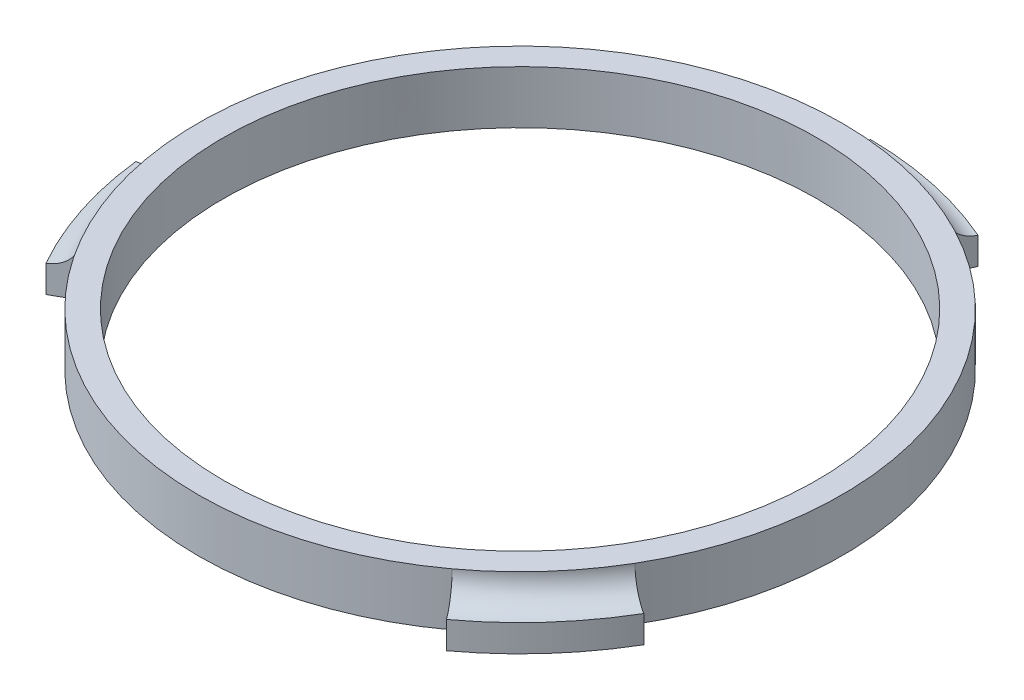
ISO-10303-21;
HEADER;
FILE_DESCRIPTION(('STEP AP214'),'2;1');
FILE_NAME('part.step','',(''),(''),'','','');
FILE_SCHEMA(('AUTOMOTIVE_DESIGN { 1 0 10303 214 1 1 1 1 }'));
ENDSEC;
DATA;
#1=APPLICATION_CONTEXT('core data for automotive mechanical design processes');
#2=APPLICATION_PROTOCOL_DEFINITION('international standard','automotive_design',2000,#1);
#3=PRODUCT_CONTEXT('',#1,'mechanical');
#4=PRODUCT('Part','Part','',(#3));
#5=PRODUCT_RELATED_PRODUCT_CATEGORY('part','',(#4));
#6=PRODUCT_DEFINITION_FORMATION('','',#4);
#7=PRODUCT_DEFINITION_CONTEXT('part definition',#1,'design');
#8=PRODUCT_DEFINITION('design','',#6,#7);
#9=PRODUCT_DEFINITION_SHAPE('','',#8);
#10=(LENGTH_UNIT() NAMED_UNIT(*) SI_UNIT(.MILLI.,.METRE.));
#11=(NAMED_UNIT(*) PLANE_ANGLE_UNIT() SI_UNIT($,.RADIAN.));
#12=(NAMED_UNIT(*) SI_UNIT($,.STERADIAN.) SOLID_ANGLE_UNIT());
#13=UNCERTAINTY_MEASURE_WITH_UNIT(LENGTH_MEASURE(1.E-05),#10,'distance_accuracy_value','');
#14=(GEOMETRIC_REPRESENTATION_CONTEXT(3) GLOBAL_UNCERTAINTY_ASSIGNED_CONTEXT((#13)) GLOBAL_UNIT_ASSIGNED_CONTEXT((#10,
#11,#12)) REPRESENTATION_CONTEXT('',''));
#15=CARTESIAN_POINT('',(0.,0.,0.));
#16=DIRECTION('',(0.,0.,1.));
#17=DIRECTION('',(1.,0.,0.));
#18=AXIS2_PLACEMENT_3D('',#15,#16,#17);
#19=CARTESIAN_POINT('',(0.,9.8,0.));
#20=DIRECTION('',(0.,-1.,0.));
#21=DIRECTION('',(0.,0.,-1.));
#22=AXIS2_PLACEMENT_3D('',#19,#20,#21);
#23=CYLINDRICAL_SURFACE('',#22,24.95);
#24=CARTESIAN_POINT('',(0.,9.8,0.));
#25=DIRECTION('',(0.,1.,0.));
#26=DIRECTION('',(0.,0.,1.));
#27=AXIS2_PLACEMENT_3D('',#24,#25,#26);
#28=CIRCLE('',#27,24.95);
#29=CARTESIAN_POINT('',(21.5229083842175,9.8,12.620099630533));
#30=VERTEX_POINT('',#29);
#31=CARTESIAN_POINT('',(9.97989349819901,9.8,-22.867099198731));
#32=VERTEX_POINT('',#31);
#33=EDGE_CURVE('E273',#30,#32,#28,.T.);
#34=ORIENTED_EDGE('',*,*,#33,.F.);
#35=DIRECTION('',(0.,1.,0.));
#36=VECTOR('',#35,1.);
#37=CARTESIAN_POINT('',(21.5229083842175,5.8,12.620099630533));
#38=LINE('',#37,#36);
#39=CARTESIAN_POINT('',(21.5229083842175,5.7,12.620099630533));
#40=VERTEX_POINT('',#39);
#41=EDGE_CURVE('E275',#40,#30,#38,.T.);
#42=ORIENTED_EDGE('',*,*,#41,.F.);
#43=CARTESIAN_POINT('',(0.,5.7,0.));
#44=DIRECTION('',(0.,-1.,0.));
#45=DIRECTION('',(0.,0.,-1.));
#46=AXIS2_PLACEMENT_3D('',#43,#44,#45);
#47=CIRCLE('',#46,24.95);
#48=CARTESIAN_POINT('',(9.97989349819902,5.7,-22.867099198731));
#49=VERTEX_POINT('',#48);
#50=EDGE_CURVE('E100',#40,#49,#47,.F.);
#51=ORIENTED_EDGE('',*,*,#50,.T.);
#52=DIRECTION('',(0.,1.,0.));
#53=VECTOR('',#52,1.);
#54=CARTESIAN_POINT('',(9.97989349819902,5.8,-22.867099198731));
#55=LINE('',#54,#53);
#56=EDGE_CURVE('E114',#49,#32,#55,.T.);
#57=ORIENTED_EDGE('',*,*,#56,.T.);
#58=EDGE_LOOP('',(#34,#42,#51,#57));
#59=FACE_BOUND('',#58,.T.);
#60=ADVANCED_FACE('F36',(#59),#23,.T.);
#61=DIRECTION('',(0.,1.,0.));
#62=VECTOR('',#61,1.);
#63=CARTESIAN_POINT('',(14.8135420678603,5.8,20.0763908958691));
#64=LINE('',#63,#62);
#65=CARTESIAN_POINT('',(14.8135420678603,5.7,20.0763908958691));
#66=VERTEX_POINT('',#65);
#67=CARTESIAN_POINT('',(14.8135420678603,9.8,20.0763908958691));
#68=VERTEX_POINT('',#67);
#69=EDGE_CURVE('E127',#66,#68,#64,.T.);
#70=ORIENTED_EDGE('',*,*,#69,.T.);
#71=CARTESIAN_POINT('',(-21.690781070441,9.8,12.3293356087908));
#72=VERTEX_POINT('',#71);
#73=EDGE_CURVE('E288',#72,#68,#28,.T.);
#74=ORIENTED_EDGE('',*,*,#73,.F.);
#75=DIRECTION('',(0.,1.,0.));
#76=VECTOR('',#75,1.);
#77=CARTESIAN_POINT('',(-21.690781070441,5.8,12.3293356087908));
#78=LINE('',#77,#76);
#79=CARTESIAN_POINT('',(-21.690781070441,5.7,12.3293356087908));
#80=VERTEX_POINT('',#79);
#81=EDGE_CURVE('E55',#80,#72,#78,.T.);
#82=ORIENTED_EDGE('',*,*,#81,.F.);
#83=CARTESIAN_POINT('',(0.,5.7,0.));
#84=DIRECTION('',(0.,-1.,0.));
#85=DIRECTION('',(0.,0.,-1.));
#86=AXIS2_PLACEMENT_3D('',#83,#84,#85);
#87=CIRCLE('',#86,24.95);
#88=EDGE_CURVE('E154',#80,#66,#87,.F.);
#89=ORIENTED_EDGE('',*,*,#88,.T.);
#90=EDGE_LOOP('',(#70,#74,#82,#89));
#91=FACE_BOUND('',#90,.T.);
#92=ADVANCED_FACE('F253',(#91),#23,.T.);
#93=CARTESIAN_POINT('',(0.,6.,0.));
#94=DIRECTION('',(0.,1.,0.));
#95=DIRECTION('',(0.,0.,1.));
#96=AXIS2_PLACEMENT_3D('',#93,#94,#95);
#97=CYLINDRICAL_SURFACE('',#96,26.95);
#98=DIRECTION('',(0.,1.,0.));
#99=VECTOR('',#98,1.);
#100=CARTESIAN_POINT('',(10.7945771498696,5.8,-24.6937158839149));
#101=LINE('',#100,#99);
#102=CARTESIAN_POINT('',(10.7945771498696,5.7,-24.6937158839149));
#103=VERTEX_POINT('',#102);
#104=CARTESIAN_POINT('',(10.7945771498696,7.8,-24.6937158839149));
#105=VERTEX_POINT('',#104);
#106=EDGE_CURVE('E112',#103,#105,#101,.T.);
#107=ORIENTED_EDGE('',*,*,#106,.F.);
#108=CARTESIAN_POINT('',(0.,5.7,0.));
#109=DIRECTION('',(0.,-1.,0.));
#110=DIRECTION('',(0.,0.,-1.));
#111=AXIS2_PLACEMENT_3D('',#108,#109,#110);
#112=CIRCLE('',#111,26.95);
#113=CARTESIAN_POINT('',(0.200013900237467,5.7,-26.949257771592));
#114=VERTEX_POINT('',#113);
#115=EDGE_CURVE('E123',#114,#103,#112,.T.);
#116=ORIENTED_EDGE('',*,*,#115,.F.);
#117=DIRECTION('',(0.,1.,0.));
#118=VECTOR('',#117,1.);
#119=CARTESIAN_POINT('',(0.200013900237467,6.,-26.949257771592));
#120=LINE('',#119,#118);
#121=CARTESIAN_POINT('',(0.200013900237467,7.8,-26.949257771592));
#122=VERTEX_POINT('',#121);
#123=EDGE_CURVE('E134',#122,#114,#120,.F.);
#124=ORIENTED_EDGE('',*,*,#123,.F.);
#125=CARTESIAN_POINT('',(0.,7.8,0.));
#126=DIRECTION('',(0.,-1.,0.));
#127=DIRECTION('',(0.,0.,-1.));
#128=AXIS2_PLACEMENT_3D('',#125,#126,#127);
#129=CIRCLE('',#128,26.95);
#130=EDGE_CURVE('E125',#122,#105,#129,.T.);
#131=ORIENTED_EDGE('',*,*,#130,.T.);
#132=EDGE_LOOP('',(#107,#116,#124,#131));
#133=FACE_BOUND('',#132,.T.);
#134=ADVANCED_FACE('F121',(#133),#97,.T.);
#135=DIRECTION('',(0.,1.,0.));
#136=VECTOR('',#135,1.);
#137=CARTESIAN_POINT('',(23.2387348932153,5.8,13.6478460045114));
#138=LINE('',#137,#136);
#139=CARTESIAN_POINT('',(23.2387348932153,5.7,13.6478460045114));
#140=VERTEX_POINT('',#139);
#141=CARTESIAN_POINT('',(23.2387348932153,7.8,13.6478460045114));
#142=VERTEX_POINT('',#141);
#143=EDGE_CURVE('E128',#140,#142,#138,.T.);
#144=ORIENTED_EDGE('',*,*,#143,.T.);
#145=CARTESIAN_POINT('',(15.9880966943707,7.8,21.6952359768557));
#146=VERTEX_POINT('',#145);
#147=EDGE_CURVE('E318',#142,#146,#129,.T.);
#148=ORIENTED_EDGE('',*,*,#147,.T.);
#149=DIRECTION('',(0.,1.,0.));
#150=VECTOR('',#149,1.);
#151=CARTESIAN_POINT('',(15.9880966943707,5.8,21.6952359768557));
#152=LINE('',#151,#150);
#153=CARTESIAN_POINT('',(15.9880966943707,5.7,21.6952359768557));
#154=VERTEX_POINT('',#153);
#155=EDGE_CURVE('E163',#154,#146,#152,.T.);
#156=ORIENTED_EDGE('',*,*,#155,.F.);
#157=CARTESIAN_POINT('',(0.,5.7,0.));
#158=DIRECTION('',(0.,-1.,0.));
#159=DIRECTION('',(0.,0.,-1.));
#160=AXIS2_PLACEMENT_3D('',#157,#158,#159);
#161=CIRCLE('',#160,26.95);
#162=EDGE_CURVE('E135',#140,#154,#161,.T.);
#163=ORIENTED_EDGE('',*,*,#162,.F.);
#164=EDGE_LOOP('',(#144,#148,#156,#163));
#165=FACE_BOUND('',#164,.T.);
#166=ADVANCED_FACE('F257',(#165),#97,.T.);
#167=DIRECTION('',(0.,1.,0.));
#168=VECTOR('',#167,1.);
#169=CARTESIAN_POINT('',(-23.4387487934526,5.8,13.3014117670805));
#170=LINE('',#169,#168);
#171=CARTESIAN_POINT('',(-23.4387487934526,5.7,13.3014117670805));
#172=VERTEX_POINT('',#171);
#173=CARTESIAN_POINT('',(-23.4387487934526,7.8,13.3014117670805));
#174=VERTEX_POINT('',#173);
#175=EDGE_CURVE('E307',#172,#174,#170,.T.);
#176=ORIENTED_EDGE('',*,*,#175,.T.);
#177=CARTESIAN_POINT('',(-26.7826738442405,7.8,2.9984799070591));
#178=VERTEX_POINT('',#177);
#179=EDGE_CURVE('E292',#174,#178,#129,.T.);
#180=ORIENTED_EDGE('',*,*,#179,.T.);
#181=DIRECTION('',(0.,1.,0.));
#182=VECTOR('',#181,1.);
#183=CARTESIAN_POINT('',(-26.7826738442405,6.,2.9984799070591));
#184=LINE('',#183,#182);
#185=CARTESIAN_POINT('',(-26.7826738442405,5.7,2.9984799070591));
#186=VERTEX_POINT('',#185);
#187=EDGE_CURVE('E137',#186,#178,#184,.T.);
#188=ORIENTED_EDGE('',*,*,#187,.F.);
#189=CARTESIAN_POINT('',(0.,5.7,0.));
#190=DIRECTION('',(0.,-1.,0.));
#191=DIRECTION('',(0.,0.,-1.));
#192=AXIS2_PLACEMENT_3D('',#189,#190,#191);
#193=CIRCLE('',#192,26.95);
#194=EDGE_CURVE('E140',#172,#186,#193,.T.);
#195=ORIENTED_EDGE('',*,*,#194,.F.);
#196=EDGE_LOOP('',(#176,#180,#188,#195));
#197=FACE_BOUND('',#196,.T.);
#198=ADVANCED_FACE('F258',(#197),#97,.T.);
#199=CARTESIAN_POINT('',(0.,5.7,0.));
#200=DIRECTION('',(0.,-1.,0.));
#201=DIRECTION('',(0.,0.,-1.));
#202=AXIS2_PLACEMENT_3D('',#199,#200,#201);
#203=PLANE('',#202);
#204=ORIENTED_EDGE('',*,*,#115,.T.);
#205=DIRECTION('',(-0.407329709642397,0.,0.913281176660639));
#206=VECTOR('',#205,1.);
#207=CARTESIAN_POINT('',(-0.182656235332074,5.7,-0.0814659419284554));
#208=LINE('',#207,#206);
#209=EDGE_CURVE('E108',#103,#49,#208,.T.);
#210=ORIENTED_EDGE('',*,*,#209,.T.);
#211=ORIENTED_EDGE('',*,*,#50,.F.);
#212=DIRECTION('',(0.857878594951562,0.,0.513852426601192));
#213=VECTOR('',#212,1.);
#214=CARTESIAN_POINT('',(0.119771478640206,5.7,-0.199958942474502));
#215=LINE('',#214,#213);
#216=EDGE_CURVE('E118',#40,#140,#215,.T.);
#217=ORIENTED_EDGE('',*,*,#216,.T.);
#218=ORIENTED_EDGE('',*,*,#162,.T.);
#219=DIRECTION('',(-0.587259844965055,0.,-0.809398464596777));
#220=VECTOR('',#219,1.);
#221=CARTESIAN_POINT('',(0.161879692919308,5.7,-0.117451968992976));
#222=LINE('',#221,#220);
#223=EDGE_CURVE('E162',#154,#66,#222,.T.);
#224=ORIENTED_EDGE('',*,*,#223,.T.);
#225=ORIENTED_EDGE('',*,*,#88,.F.);
#226=DIRECTION('',(-0.873948552708695,0.,0.486018443290353));
#227=VECTOR('',#226,1.);
#228=CARTESIAN_POINT('',(0.113283784576686,5.7,0.203704614388495));
#229=LINE('',#228,#227);
#230=EDGE_CURVE('E159',#80,#172,#229,.T.);
#231=ORIENTED_EDGE('',*,*,#230,.T.);
#232=ORIENTED_EDGE('',*,*,#194,.T.);
#233=DIRECTION('',(0.994589554607456,0.,-0.103882712063855));
#234=VECTOR('',#233,1.);
#235=CARTESIAN_POINT('',(0.0207765424127649,5.7,0.198917910921433));
#236=LINE('',#235,#234);
#237=CARTESIAN_POINT('',(-24.7934355660594,5.7,2.79070830286179));
#238=VERTEX_POINT('',#237);
#239=EDGE_CURVE('E150',#186,#238,#236,.T.);
#240=ORIENTED_EDGE('',*,*,#239,.T.);
#241=CARTESIAN_POINT('',(0.,5.7,0.));
#242=DIRECTION('',(0.,-1.,0.));
#243=DIRECTION('',(0.,0.,-1.));
#244=AXIS2_PLACEMENT_3D('',#241,#242,#243);
#245=CIRCLE('',#244,24.95);
#246=CARTESIAN_POINT('',(0.167872686223692,5.7,-24.949435239324));
#247=VERTEX_POINT('',#246);
#248=EDGE_CURVE('E152',#247,#238,#245,.F.);
#249=ORIENTED_EDGE('',*,*,#248,.F.);
#250=DIRECTION('',(0.0160699577571395,0.,-0.999870869891549));
#251=VECTOR('',#250,1.);
#252=CARTESIAN_POINT('',(-0.233055263216893,5.7,-0.00374567191399497));
#253=LINE('',#252,#251);
#254=EDGE_CURVE('E133',#247,#114,#253,.T.);
#255=ORIENTED_EDGE('',*,*,#254,.T.);
#256=EDGE_LOOP('',(#204,#210,#211,#217,#218,#224,#225,#231,#232,#240,#249,#255));
#257=FACE_BOUND('',#256,.T.);
#258=CARTESIAN_POINT('',(0.,5.7,0.));
#259=DIRECTION('',(0.,-1.,0.));
#260=DIRECTION('',(0.,0.,-1.));
#261=AXIS2_PLACEMENT_3D('',#258,#259,#260);
#262=CIRCLE('',#261,23.);
#263=CARTESIAN_POINT('',(0.,5.7,-23.));
#264=VERTEX_POINT('',#263);
#265=EDGE_CURVE('E40',#264,#264,#262,.T.);
#266=ORIENTED_EDGE('',*,*,#265,.F.);
#267=EDGE_LOOP('',(#266));
#268=FACE_BOUND('',#267,.T.);
#269=ADVANCED_FACE('F38',(#257,#268),#203,.T.);
#270=CARTESIAN_POINT('',(0.,6.,0.));
#271=DIRECTION('',(0.,1.,0.));
#272=DIRECTION('',(0.,0.,1.));
#273=AXIS2_PLACEMENT_3D('',#270,#271,#272);
#274=CYLINDRICAL_SURFACE('',#273,23.);
#275=ORIENTED_EDGE('',*,*,#265,.T.);
#276=EDGE_LOOP('',(#275));
#277=FACE_BOUND('',#276,.T.);
#278=CARTESIAN_POINT('',(0.,9.8,0.));
#279=DIRECTION('',(0.,1.,0.));
#280=DIRECTION('',(0.,0.,1.));
#281=AXIS2_PLACEMENT_3D('',#278,#279,#280);
#282=CIRCLE('',#281,23.);
#283=CARTESIAN_POINT('',(0.,9.8,23.));
#284=VERTEX_POINT('',#283);
#285=EDGE_CURVE('E157',#284,#284,#282,.T.);
#286=ORIENTED_EDGE('',*,*,#285,.T.);
#287=EDGE_LOOP('',(#286));
#288=FACE_BOUND('',#287,.T.);
#289=ADVANCED_FACE('F248',(#277,#288),#274,.F.);
#290=CARTESIAN_POINT('',(0.,9.8,0.));
#291=DIRECTION('',(0.,1.,0.));
#292=DIRECTION('',(0.,0.,1.));
#293=AXIS2_PLACEMENT_3D('',#290,#291,#292);
#294=PLANE('',#293);
#295=EDGE_CURVE('E280',#68,#30,#28,.T.);
#296=ORIENTED_EDGE('',*,*,#295,.T.);
#297=ORIENTED_EDGE('',*,*,#33,.T.);
#298=CARTESIAN_POINT('',(0.167872686223692,9.8,-24.949435239324));
#299=VERTEX_POINT('',#298);
#300=EDGE_CURVE('E281',#32,#299,#28,.T.);
#301=ORIENTED_EDGE('',*,*,#300,.T.);
#302=CARTESIAN_POINT('',(-24.7934355660594,9.8,2.79070830286179));
#303=VERTEX_POINT('',#302);
#304=EDGE_CURVE('E296',#299,#303,#28,.T.);
#305=ORIENTED_EDGE('',*,*,#304,.T.);
#306=EDGE_CURVE('E295',#303,#72,#28,.T.);
#307=ORIENTED_EDGE('',*,*,#306,.T.);
#308=ORIENTED_EDGE('',*,*,#73,.T.);
#309=EDGE_LOOP('',(#296,#297,#301,#305,#307,#308));
#310=FACE_BOUND('',#309,.T.);
#311=ORIENTED_EDGE('',*,*,#285,.F.);
#312=EDGE_LOOP('',(#311));
#313=FACE_BOUND('',#312,.T.);
#314=ADVANCED_FACE('F245',(#310,#313),#294,.T.);
#315=DIRECTION('',(0.,1.,0.));
#316=VECTOR('',#315,1.);
#317=CARTESIAN_POINT('',(-24.7934355660594,5.8,2.79070830286179));
#318=LINE('',#317,#316);
#319=EDGE_CURVE('E117',#238,#303,#318,.T.);
#320=ORIENTED_EDGE('',*,*,#319,.T.);
#321=ORIENTED_EDGE('',*,*,#304,.F.);
#322=DIRECTION('',(0.,1.,0.));
#323=VECTOR('',#322,1.);
#324=CARTESIAN_POINT('',(0.167872686223692,5.8,-24.949435239324));
#325=LINE('',#324,#323);
#326=EDGE_CURVE('E151',#247,#299,#325,.T.);
#327=ORIENTED_EDGE('',*,*,#326,.F.);
#328=ORIENTED_EDGE('',*,*,#248,.T.);
#329=EDGE_LOOP('',(#320,#321,#327,#328));
#330=FACE_BOUND('',#329,.T.);
#331=ADVANCED_FACE('F243',(#330),#23,.T.);
#332=CARTESIAN_POINT('',(0.0207765424127649,5.8,0.198917910921433));
#333=DIRECTION('',(-0.103882712063855,0.,-0.994589554607456));
#334=DIRECTION('',(-0.994589554607456,0.,0.103882712063855));
#335=AXIS2_PLACEMENT_3D('',#332,#333,#334);
#336=PLANE('',#335);
#337=ORIENTED_EDGE('',*,*,#187,.T.);
#338=CARTESIAN_POINT('',(-26.7826738442405,7.8,2.9984799070591));
#339=CARTESIAN_POINT('',(-26.7267059669035,7.80000037507304,2.99263418420862));
#340=CARTESIAN_POINT('',(-26.6707649025451,7.80237629081219,2.98679126191533));
#341=CARTESIAN_POINT('',(-26.559283073409,7.81185478614124,2.97514722774782));
#342=CARTESIAN_POINT('',(-26.5037422895734,7.81895713917749,2.96934611388305));
#343=CARTESIAN_POINT('',(-26.3384141399773,7.84728640793236,2.95207794885861));
#344=CARTESIAN_POINT('',(-26.2297342019938,7.87553572032163,2.9407265661175));
#345=CARTESIAN_POINT('',(-26.0186369627336,7.94997750897583,2.91867791939488));
#346=CARTESIAN_POINT('',(-25.9162226963508,7.99617860211128,2.90798097240144));
#347=CARTESIAN_POINT('',(-25.7205653954213,8.10520780264979,2.88754499359843));
#348=CARTESIAN_POINT('',(-25.6273207473403,8.16803297758514,2.87780579325872));
#349=CARTESIAN_POINT('',(-25.452650381133,8.30852727016949,2.85956185406317));
#350=CARTESIAN_POINT('',(-25.3712244227002,8.38619608593182,2.85105709010781));
#351=CARTESIAN_POINT('',(-25.2224801677734,8.55419472798664,2.83552107675021));
#352=CARTESIAN_POINT('',(-25.155164633278,8.6445270272872,2.8284901158327));
#353=CARTESIAN_POINT('',(-25.0365661518002,8.83527894108358,2.81610276283317));
#354=CARTESIAN_POINT('',(-24.9852859029211,8.93570024940803,2.81074665256215));
#355=CARTESIAN_POINT('',(-24.9002484145221,9.14375403953115,2.80186467217029));
#356=CARTESIAN_POINT('',(-24.8664809026997,9.25138225210453,2.7983377291298));
#357=CARTESIAN_POINT('',(-24.8258215339936,9.43305785374787,2.79409094665313));
#358=CARTESIAN_POINT('',(-24.8136841366892,9.5059621462229,2.79282322194846));
#359=CARTESIAN_POINT('',(-24.7974922239187,9.65256743491838,2.79113201193694));
#360=CARTESIAN_POINT('',(-24.7934262511229,9.72626715230253,2.79070732993697));
#361=CARTESIAN_POINT('',(-24.7934355660594,9.8,2.79070830286179));
#362=B_SPLINE_CURVE_WITH_KNOTS('',3,(#338,#339,#340,#341,#342,#343,#344,#345,#346,#347,#348,
#349,#350,#351,#352,#353,#354,#355,#356,#357,#358,#359,#360,#361),.UNSPECIFIED.,.F.,.F.,(4,2,2,
2,2,2,2,2,2,2,2,4),(0.,0.168713315722655,0.337418545044446,0.674272803683434,1.01128895280379,
1.34824569227294,1.68519557951992,2.02221136045157,2.3592838173109,2.69615833609002,
2.91749353683159,3.13851432852372),.UNSPECIFIED.);
#363=EDGE_CURVE('E215',#178,#303,#362,.T.);
#364=ORIENTED_EDGE('',*,*,#363,.T.);
#365=ORIENTED_EDGE('',*,*,#319,.F.);
#366=ORIENTED_EDGE('',*,*,#239,.F.);
#367=EDGE_LOOP('',(#337,#364,#365,#366));
#368=FACE_BOUND('',#367,.T.);
#369=ADVANCED_FACE('F238',(#368),#336,.T.);
#370=CARTESIAN_POINT('',(-0.233055263216893,5.8,-0.00374567191399497));
#371=DIRECTION('',(-0.999870869891549,0.,-0.0160699577571395));
#372=DIRECTION('',(-0.0160699577571395,0.,0.999870869891549));
#373=AXIS2_PLACEMENT_3D('',#370,#371,#372);
#374=PLANE('',#373);
#375=ORIENTED_EDGE('',*,*,#326,.T.);
#376=CARTESIAN_POINT('',(0.167872686223692,9.8,-24.949435239324));
#377=CARTESIAN_POINT('',(0.167872692215162,9.74373224008068,-24.9494356121125));
#378=CARTESIAN_POINT('',(0.167910870679109,9.68749143746776,-24.9518110716212));
#379=CARTESIAN_POINT('',(0.168063179956321,9.57541229737275,-24.9612877368246));
#380=CARTESIAN_POINT('',(0.168177307119228,9.51957394067809,-24.9683887153946));
#381=CARTESIAN_POINT('',(0.168632526926819,9.3533602661339,-24.9967124379511));
#382=CARTESIAN_POINT('',(0.169086460901175,9.24409834154989,-25.0249561561159));
#383=CARTESIAN_POINT('',(0.170282648510404,9.03187079450797,-25.0993828076024));
#384=CARTESIAN_POINT('',(0.171025040420827,8.92890821915329,-25.1455743444125));
#385=CARTESIAN_POINT('',(0.172776988629821,8.7322030950244,-25.2545803546463));
#386=CARTESIAN_POINT('',(0.173786497958095,8.63845892924348,-25.3173919055837));
#387=CARTESIAN_POINT('',(0.176044058572697,8.46284923608486,-25.4578570598591));
#388=CARTESIAN_POINT('',(0.177292112360926,8.3809838333098,-25.535510818865));
#389=CARTESIAN_POINT('',(0.179991659887859,8.23143546606121,-25.7034763465198));
#390=CARTESIAN_POINT('',(0.181443193396366,8.16375528053459,-25.7937905896411));
#391=CARTESIAN_POINT('',(0.184508449880379,8.04450776836399,-25.9845104853265));
#392=CARTESIAN_POINT('',(0.186122211074315,7.9929442503796,-26.0849185158368));
#393=CARTESIAN_POINT('',(0.18946562284382,7.90743431407181,-26.292945200468));
#394=CARTESIAN_POINT('',(0.191195204922988,7.87347758520423,-26.4005595927509));
#395=CARTESIAN_POINT('',(0.194115120059987,7.83258126768932,-26.5822363670251));
#396=CARTESIAN_POINT('',(0.1952870891192,7.82037068185524,-26.6551561431957));
#397=CARTESIAN_POINT('',(0.197643841791872,7.80408112155754,-26.8017930155856));
#398=CARTESIAN_POINT('',(0.198828604839093,7.79999062161065,-26.8755088321759));
#399=CARTESIAN_POINT('',(0.200013900237467,7.8,-26.949257771592));
#400=B_SPLINE_CURVE_WITH_KNOTS('',3,(#376,#377,#378,#379,#380,#381,#382,#383,#384,#385,#386,
#387,#388,#389,#390,#391,#392,#393,#394,#395,#396,#397,#398,#399),.UNSPECIFIED.,.F.,.F.,(4,2,2,
2,2,2,2,2,2,2,2,4),(0.,0.168699593920957,0.337391080142242,0.674217224570335,1.01120502998575,
1.34813361833085,1.68506574064275,2.02206380788137,2.35914145374152,2.69602148319857,
2.9174335300612,3.13853108386011),.UNSPECIFIED.);
#401=EDGE_CURVE('E46',#299,#122,#400,.T.);
#402=ORIENTED_EDGE('',*,*,#401,.T.);
#403=ORIENTED_EDGE('',*,*,#123,.T.);
#404=ORIENTED_EDGE('',*,*,#254,.F.);
#405=EDGE_LOOP('',(#375,#402,#403,#404));
#406=FACE_BOUND('',#405,.T.);
#407=ADVANCED_FACE('F235',(#406),#374,.T.);
#408=CARTESIAN_POINT('',(0.161879692919308,5.8,-0.117451968992976));
#409=DIRECTION('',(-0.809398464596777,0.,0.587259844965055));
#410=DIRECTION('',(0.587259844965055,0.,0.809398464596777));
#411=AXIS2_PLACEMENT_3D('',#408,#409,#410);
#412=PLANE('',#411);
#413=ORIENTED_EDGE('',*,*,#155,.T.);
#414=CARTESIAN_POINT('',(15.9880966943707,7.8,21.6952359768557));
#415=CARTESIAN_POINT('',(15.9550502112102,7.80000037507304,21.6496892347112));
#416=CARTESIAN_POINT('',(15.9220195598927,7.80237629081219,21.6041643130087));
#417=CARTESIAN_POINT('',(15.856194615933,7.81185478614124,21.5134402340002));
#418=CARTESIAN_POINT('',(15.8234003120381,7.81895713917749,21.4682410611849));
#419=CARTESIAN_POINT('',(15.7257815676521,7.84728640793236,21.3336967661862));
#420=CARTESIAN_POINT('',(15.6616110128385,7.87553572032163,21.2452528703813));
#421=CARTESIAN_POINT('',(15.5369677050276,7.94997750897583,21.0734616218745));
#422=CARTESIAN_POINT('',(15.4764967439969,7.99617860211128,20.9901167389739));
#423=CARTESIAN_POINT('',(15.3609700167376,8.10520780264979,20.8308905353345));
#424=CARTESIAN_POINT('',(15.3059132977903,8.16803297758514,20.7550079014992));
#425=CARTESIAN_POINT('',(15.2027783998782,8.30852727016949,20.6128608966732));
#426=CARTESIAN_POINT('',(15.1547000790233,8.38619608593182,20.5465963301206));
#427=CARTESIAN_POINT('',(15.0668733693187,8.55419472798664,20.4255480333658));
#428=CARTESIAN_POINT('',(15.0271266113034,8.6445270272872,20.3707665508822));
#429=CARTESIAN_POINT('',(14.9570996081813,8.83527894108359,20.2742509295719));
#430=CARTESIAN_POINT('',(14.9268209561815,8.93570024940803,20.2325189864657));
#431=CARTESIAN_POINT('',(14.8766101913268,9.14375403953115,20.1633153514341));
#432=CARTESIAN_POINT('',(14.8566720131448,9.25138225210453,20.1358352998936));
#433=CARTESIAN_POINT('',(14.8326645072826,9.43305785374787,20.1027466449306));
#434=CARTESIAN_POINT('',(14.8254979268312,9.5059621462229,20.0928692128815));
#435=CARTESIAN_POINT('',(14.8159373396128,9.65256743491838,20.0796922100921));
#436=CARTESIAN_POINT('',(14.8135365678144,9.72626715230253,20.0763833153598));
#437=CARTESIAN_POINT('',(14.8135420678603,9.8,20.0763908958691));
#438=B_SPLINE_CURVE_WITH_KNOTS('',3,(#414,#415,#416,#417,#418,#419,#420,#421,#422,#423,#424,
#425,#426,#427,#428,#429,#430,#431,#432,#433,#434,#435,#436,#437),.UNSPECIFIED.,.F.,.F.,(4,2,2,
2,2,2,2,2,2,2,2,4),(0.,0.168713315722659,0.337418545044447,0.674272803683434,1.01128895280379,
1.34824569227294,1.68519557951992,2.02221136045158,2.3592838173109,2.69615833609002,
2.91749353683159,3.13851432852372),.UNSPECIFIED.);
#439=EDGE_CURVE('E171',#146,#68,#438,.T.);
#440=ORIENTED_EDGE('',*,*,#439,.T.);
#441=ORIENTED_EDGE('',*,*,#69,.F.);
#442=ORIENTED_EDGE('',*,*,#223,.F.);
#443=EDGE_LOOP('',(#413,#440,#441,#442));
#444=FACE_BOUND('',#443,.T.);
#445=ADVANCED_FACE('F207',(#444),#412,.T.);
#446=CARTESIAN_POINT('',(0.113283784576686,5.8,0.203704614388495));
#447=DIRECTION('',(0.486018443290353,0.,0.873948552708695));
#448=DIRECTION('',(0.873948552708695,0.,-0.486018443290353));
#449=AXIS2_PLACEMENT_3D('',#446,#447,#448);
#450=PLANE('',#449);
#451=ORIENTED_EDGE('',*,*,#81,.T.);
#452=CARTESIAN_POINT('',(-21.690781070441,9.8,12.3293356087908));
#453=CARTESIAN_POINT('',(-21.6907813962811,9.74373224008068,12.3293357899963));
#454=CARTESIAN_POINT('',(-21.6928576937933,9.68749143746776,12.330490456231));
#455=CARTESIAN_POINT('',(-21.7011408812412,9.57541229737275,12.3350968851294));
#456=CARTESIAN_POINT('',(-21.707347572656,9.51957394067809,12.3385485373921));
#457=CARTESIAN_POINT('',(-21.7321042458235,9.3533602661339,12.3523161667527));
#458=CARTESIAN_POINT('',(-21.7567909902387,9.24409834154988,12.3660449074816));
#459=CARTESIAN_POINT('',(-21.8218444549492,9.03187079450797,12.4022223043676));
#460=CARTESIAN_POINT('',(-21.8622186952218,8.92890821915329,12.4246751425186));
#461=CARTESIAN_POINT('',(-21.957496643354,8.7322030950244,12.4776609159805));
#462=CARTESIAN_POINT('',(-22.012397796781,8.63845892924347,12.5081924307255));
#463=CARTESIAN_POINT('',(-22.1351729690373,8.46284923608486,12.5764699030204));
#464=CARTESIAN_POINT('',(-22.2030471239298,8.3809838333098,12.6142159362374));
#465=CARTESIAN_POINT('',(-22.3498593116024,8.23143546606121,12.6958608233278));
#466=CARTESIAN_POINT('',(-22.4287995072233,8.16375528053459,12.7397608799956));
#467=CARTESIAN_POINT('',(-22.595500410136,8.04450776836399,12.8324662378541));
#468=CARTESIAN_POINT('',(-22.6832631958988,7.9929442503796,12.8812726949196));
#469=CARTESIAN_POINT('',(-22.8650912953392,7.90743431407181,12.9823905577075));
#470=CARTESIAN_POINT('',(-22.9591528839086,7.87347758520423,13.0346998918305));
#471=CARTESIAN_POINT('',(-23.1179495432763,7.83258126768933,13.1230095582821));
#472=CARTESIAN_POINT('',(-23.1816859064079,7.82037068185524,13.1584544913896));
#473=CARTESIAN_POINT('',(-23.3098555393653,7.80408112155754,13.2297319198996));
#474=CARTESIAN_POINT('',(-23.3742876907169,7.79999062161065,13.2655637932984));
#475=CARTESIAN_POINT('',(-23.4387487934526,7.8,13.3014117670805));
#476=B_SPLINE_CURVE_WITH_KNOTS('',3,(#452,#453,#454,#455,#456,#457,#458,#459,#460,#461,#462,
#463,#464,#465,#466,#467,#468,#469,#470,#471,#472,#473,#474,#475),.UNSPECIFIED.,.F.,.F.,(4,2,2,
2,2,2,2,2,2,2,2,4),(0.,0.168699593920957,0.337391080142244,0.674217224570337,1.01120502998575,
1.34813361833086,1.68506574064276,2.02206380788137,2.35914145374152,2.69602148319857,
2.9174335300612,3.1385310838601),.UNSPECIFIED.);
#477=EDGE_CURVE('E179',#72,#174,#476,.T.);
#478=ORIENTED_EDGE('',*,*,#477,.T.);
#479=ORIENTED_EDGE('',*,*,#175,.F.);
#480=ORIENTED_EDGE('',*,*,#230,.F.);
#481=EDGE_LOOP('',(#451,#478,#479,#480));
#482=FACE_BOUND('',#481,.T.);
#483=ADVANCED_FACE('F204',(#482),#450,.T.);
#484=CARTESIAN_POINT('',(-0.182656235332074,5.8,-0.0814659419284554));
#485=DIRECTION('',(0.913281176660639,0.,0.407329709642397));
#486=DIRECTION('',(0.407329709642397,0.,-0.913281176660639));
#487=AXIS2_PLACEMENT_3D('',#484,#485,#486);
#488=PLANE('',#487);
#489=ORIENTED_EDGE('',*,*,#106,.T.);
#490=CARTESIAN_POINT('',(10.7945771498696,7.8,-24.6937158839149));
#491=CARTESIAN_POINT('',(10.7716557556931,7.80000037507304,-24.64232341892));
#492=CARTESIAN_POINT('',(10.7487453426523,7.80237629081219,-24.5909555749242));
#493=CARTESIAN_POINT('',(10.7030884574758,7.81185478614125,-24.4885874617482));
#494=CARTESIAN_POINT('',(10.6803419775352,7.81895713917749,-24.4375871750681));
#495=CARTESIAN_POINT('',(10.612632572325,7.84728640793236,-24.285774715045));
#496=CARTESIAN_POINT('',(10.5681231891551,7.87553572032163,-24.185979436499));
#497=CARTESIAN_POINT('',(10.4816692577059,7.94997750897583,-23.9921395412696));
#498=CARTESIAN_POINT('',(10.4397259523538,7.99617860211128,-23.8980977113755));
#499=CARTESIAN_POINT('',(10.3595953786836,8.10520780264979,-23.7184355289331));
#500=CARTESIAN_POINT('',(10.3214074495498,8.16803297758514,-23.6328136947581));
#501=CARTESIAN_POINT('',(10.2498719812547,8.30852727016949,-23.4724227507365));
#502=CARTESIAN_POINT('',(10.2165243436768,8.38619608593182,-23.3976534202286));
#503=CARTESIAN_POINT('',(10.1556067984546,8.55419472798665,-23.2610691101162));
#504=CARTESIAN_POINT('',(10.1280380219745,8.6445270272872,-23.1992566667151));
#505=CARTESIAN_POINT('',(10.0794665436188,8.83527894108359,-23.0903536924053));
#506=CARTESIAN_POINT('',(10.0584649467394,8.93570024940803,-23.043265639028));
#507=CARTESIAN_POINT('',(10.0236382231952,9.14375403953115,-22.9651800236046));
#508=CARTESIAN_POINT('',(10.0098088895548,9.25138225210453,-22.9341730290235));
#509=CARTESIAN_POINT('',(9.99315702671088,9.43305785374787,-22.8968375915839));
#510=CARTESIAN_POINT('',(9.98818620985791,9.5059621462229,-22.8856924348301));
#511=CARTESIAN_POINT('',(9.98155488430577,9.65256743491838,-22.8708242220292));
#512=CARTESIAN_POINT('',(9.97988968330838,9.72626715230253,-22.867090645297));
#513=CARTESIAN_POINT('',(9.97989349819902,9.8,-22.867099198731));
#514=B_SPLINE_CURVE_WITH_KNOTS('',3,(#490,#491,#492,#493,#494,#495,#496,#497,#498,#499,#500,
#501,#502,#503,#504,#505,#506,#507,#508,#509,#510,#511,#512,#513),.UNSPECIFIED.,.F.,.F.,(4,2,2,
2,2,2,2,2,2,2,2,4),(0.,0.168713315722657,0.337418545044448,0.674272803683432,1.01128895280379,
1.34824569227293,1.68519557951992,2.02221136045157,2.3592838173109,2.69615833609002,
2.91749353683159,3.13851432852372),.UNSPECIFIED.);
#515=EDGE_CURVE('E11',#105,#32,#514,.T.);
#516=ORIENTED_EDGE('',*,*,#515,.T.);
#517=ORIENTED_EDGE('',*,*,#56,.F.);
#518=ORIENTED_EDGE('',*,*,#209,.F.);
#519=EDGE_LOOP('',(#489,#516,#517,#518));
#520=FACE_BOUND('',#519,.T.);
#521=ADVANCED_FACE('F110',(#520),#488,.T.);
#522=CARTESIAN_POINT('',(0.119771478640206,5.8,-0.199958942474502));
#523=DIRECTION('',(0.513852426601192,0.,-0.857878594951562));
#524=DIRECTION('',(-0.857878594951562,0.,-0.513852426601192));
#525=AXIS2_PLACEMENT_3D('',#522,#523,#524);
#526=PLANE('',#525);
#527=ORIENTED_EDGE('',*,*,#41,.T.);
#528=CARTESIAN_POINT('',(21.5229083842175,9.8,12.620099630533));
#529=CARTESIAN_POINT('',(21.5229087040661,9.74373224008067,12.6200998221161));
#530=CARTESIAN_POINT('',(21.5249468231143,9.68749143746776,12.6213206153901));
#531=CARTESIAN_POINT('',(21.5330777012851,9.57541229737275,12.6261908516951));
#532=CARTESIAN_POINT('',(21.539170265537,9.51957394067809,12.6298401780024));
#533=CARTESIAN_POINT('',(21.5634717188968,9.3533602661339,12.6443962711984));
#534=CARTESIAN_POINT('',(21.5877045293377,9.24409834154989,12.6589112486342));
#535=CARTESIAN_POINT('',(21.651561806439,9.03187079450797,12.6971605032347));
#536=CARTESIAN_POINT('',(21.6911936548011,8.92890821915329,12.7208992018937));
#537=CARTESIAN_POINT('',(21.7847196547243,8.7322030950244,12.7769194386658));
#538=CARTESIAN_POINT('',(21.8386112988231,8.63845892924348,12.8091994748581));
#539=CARTESIAN_POINT('',(21.9591289104647,8.46284923608486,12.8813871568386));
#540=CARTESIAN_POINT('',(22.0257550115691,8.3809838333098,12.9212948826274));
#541=CARTESIAN_POINT('',(22.1698676517147,8.23143546606121,13.0076155231919));
#542=CARTESIAN_POINT('',(22.2473563138271,8.16375528053459,13.0540297096454));
#543=CARTESIAN_POINT('',(22.4109919602558,8.04450776836399,13.1520442474723));
#544=CARTESIAN_POINT('',(22.4971409848247,7.9929442503796,13.2036458209171));
#545=CARTESIAN_POINT('',(22.6756256724956,7.90743431407181,13.3105546427604));
#546=CARTESIAN_POINT('',(22.7679576789858,7.87347758520423,13.3658597009203));
#547=CARTESIAN_POINT('',(22.9238344232165,7.83258126768932,13.459226808743));
#548=CARTESIAN_POINT('',(22.9863988172889,7.82037068185524,13.496701651806));
#549=CARTESIAN_POINT('',(23.1122116975736,7.80408112155754,13.5720610956859));
#550=CARTESIAN_POINT('',(23.175459085878,7.79999062161065,13.6099450388774));
#551=CARTESIAN_POINT('',(23.2387348932153,7.8,13.6478460045114));
#552=B_SPLINE_CURVE_WITH_KNOTS('',3,(#528,#529,#530,#531,#532,#533,#534,#535,#536,#537,#538,
#539,#540,#541,#542,#543,#544,#545,#546,#547,#548,#549,#550,#551),.UNSPECIFIED.,.F.,.F.,(4,2,2,
2,2,2,2,2,2,2,2,4),(0.,0.168699593920961,0.337391080142245,0.674217224570337,1.01120502998575,
1.34813361833086,1.68506574064276,2.02206380788137,2.35914145374152,2.69602148319857,
2.91743353006121,3.13853108386011),.UNSPECIFIED.);
#553=EDGE_CURVE('E169',#30,#142,#552,.T.);
#554=ORIENTED_EDGE('',*,*,#553,.T.);
#555=ORIENTED_EDGE('',*,*,#143,.F.);
#556=ORIENTED_EDGE('',*,*,#216,.F.);
#557=EDGE_LOOP('',(#527,#554,#555,#556));
#558=FACE_BOUND('',#557,.T.);
#559=ADVANCED_FACE('F198',(#558),#526,.T.);
#560=CARTESIAN_POINT('',(0.,9.8,0.));
#561=DIRECTION('',(0.,-1.,0.));
#562=DIRECTION('',(0.,0.,-1.));
#563=AXIS2_PLACEMENT_3D('',#560,#561,#562);
#564=TOROIDAL_SURFACE('',#563,26.95,2.);
#565=ORIENTED_EDGE('',*,*,#439,.F.);
#566=ORIENTED_EDGE('',*,*,#147,.F.);
#567=ORIENTED_EDGE('',*,*,#553,.F.);
#568=ORIENTED_EDGE('',*,*,#295,.F.);
#569=EDGE_LOOP('',(#565,#566,#567,#568));
#570=FACE_BOUND('',#569,.T.);
#571=ADVANCED_FACE('F194',(#570),#564,.F.);
#572=CARTESIAN_POINT('',(0.,9.8,0.));
#573=DIRECTION('',(0.,-1.,0.));
#574=DIRECTION('',(0.,0.,-1.));
#575=AXIS2_PLACEMENT_3D('',#572,#573,#574);
#576=TOROIDAL_SURFACE('',#575,26.95,2.);
#577=ORIENTED_EDGE('',*,*,#363,.F.);
#578=ORIENTED_EDGE('',*,*,#179,.F.);
#579=ORIENTED_EDGE('',*,*,#477,.F.);
#580=ORIENTED_EDGE('',*,*,#306,.F.);
#581=EDGE_LOOP('',(#577,#578,#579,#580));
#582=FACE_BOUND('',#581,.T.);
#583=ADVANCED_FACE('F221',(#582),#576,.F.);
#584=CARTESIAN_POINT('',(0.,9.8,0.));
#585=DIRECTION('',(0.,-1.,0.));
#586=DIRECTION('',(0.,0.,-1.));
#587=AXIS2_PLACEMENT_3D('',#584,#585,#586);
#588=TOROIDAL_SURFACE('',#587,26.95,2.);
#589=ORIENTED_EDGE('',*,*,#515,.F.);
#590=ORIENTED_EDGE('',*,*,#130,.F.);
#591=ORIENTED_EDGE('',*,*,#401,.F.);
#592=ORIENTED_EDGE('',*,*,#300,.F.);
#593=EDGE_LOOP('',(#589,#590,#591,#592));
#594=FACE_BOUND('',#593,.T.);
#595=ADVANCED_FACE('F224',(#594),#588,.F.);
#596=CLOSED_SHELL('',(#60,#92,#134,#166,#198,#269,#289,#314,#331,#369,#407,#445,#483,#521,#559,
#571,#583,#595));
#597=MANIFOLD_SOLID_BREP('B2',#596);
#598=ADVANCED_BREP_SHAPE_REPRESENTATION('',(#18,#597),#14);
#599=SHAPE_DEFINITION_REPRESENTATION(#9,#598);
ENDSEC;
END-ISO-10303-21;
